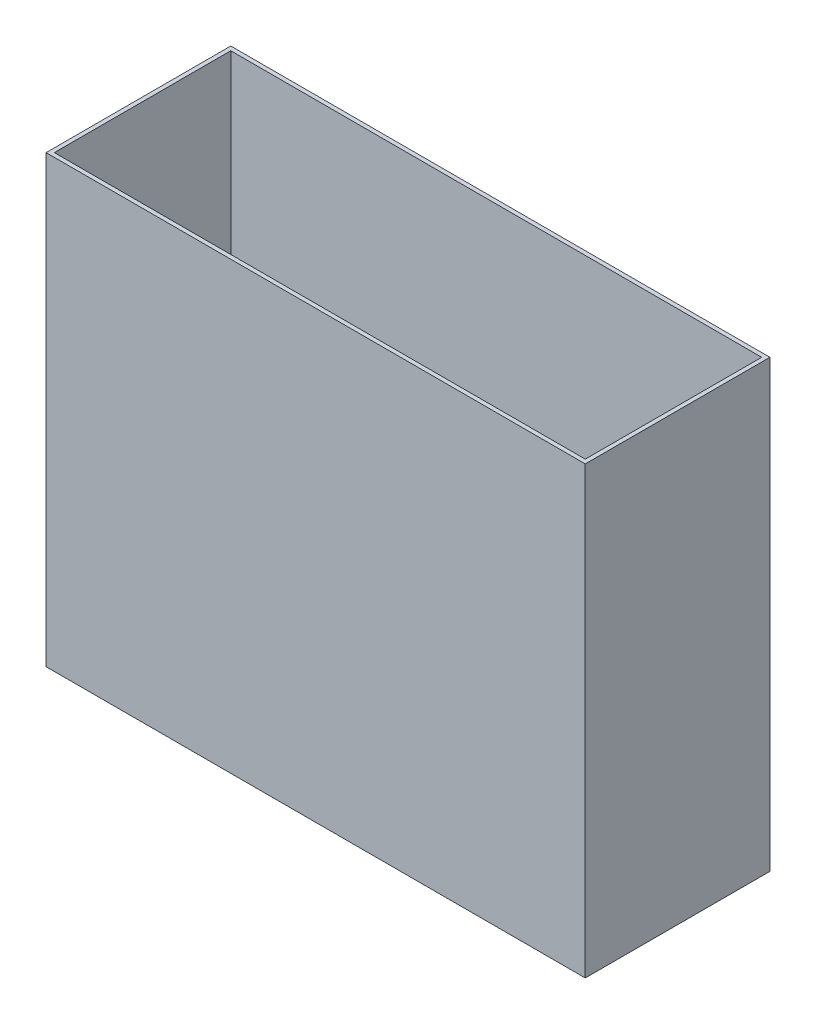
ISO-10303-21;
HEADER;
FILE_DESCRIPTION(('STEP AP214'),'2;1');
FILE_NAME('part.step','',(''),(''),'','','');
FILE_SCHEMA(('AUTOMOTIVE_DESIGN { 1 0 10303 214 1 1 1 1 }'));
ENDSEC;
DATA;
#1=APPLICATION_CONTEXT('core data for automotive mechanical design processes');
#2=APPLICATION_PROTOCOL_DEFINITION('international standard','automotive_design',2000,#1);
#3=PRODUCT_CONTEXT('',#1,'mechanical');
#4=PRODUCT('Part','Part','',(#3));
#5=PRODUCT_RELATED_PRODUCT_CATEGORY('part','',(#4));
#6=PRODUCT_DEFINITION_FORMATION('','',#4);
#7=PRODUCT_DEFINITION_CONTEXT('part definition',#1,'design');
#8=PRODUCT_DEFINITION('design','',#6,#7);
#9=PRODUCT_DEFINITION_SHAPE('','',#8);
#10=(LENGTH_UNIT() NAMED_UNIT(*) SI_UNIT(.MILLI.,.METRE.));
#11=(NAMED_UNIT(*) PLANE_ANGLE_UNIT() SI_UNIT($,.RADIAN.));
#12=(NAMED_UNIT(*) SI_UNIT($,.STERADIAN.) SOLID_ANGLE_UNIT());
#13=UNCERTAINTY_MEASURE_WITH_UNIT(LENGTH_MEASURE(1.E-05),#10,'distance_accuracy_value','');
#14=(GEOMETRIC_REPRESENTATION_CONTEXT(3) GLOBAL_UNCERTAINTY_ASSIGNED_CONTEXT((#13)) GLOBAL_UNIT_ASSIGNED_CONTEXT((#10,
#11,#12)) REPRESENTATION_CONTEXT('',''));
#15=CARTESIAN_POINT('',(0.,0.,0.));
#16=DIRECTION('',(0.,0.,1.));
#17=DIRECTION('',(1.,0.,0.));
#18=AXIS2_PLACEMENT_3D('',#15,#16,#17);
#19=CARTESIAN_POINT('',(-2.59999999999999,280.,-112.));
#20=DIRECTION('',(1.,0.,0.));
#21=DIRECTION('',(0.,0.,-1.));
#22=AXIS2_PLACEMENT_3D('',#19,#20,#21);
#23=PLANE('',#22);
#24=DIRECTION('',(0.,0.,1.));
#25=VECTOR('',#24,1.);
#26=CARTESIAN_POINT('',(-2.59999999999999,-2.59999999999999,-112.));
#27=LINE('',#26,#25);
#28=CARTESIAN_POINT('',(-2.59999999999999,-2.6,-114.6));
#29=VERTEX_POINT('',#28);
#30=CARTESIAN_POINT('',(-2.6,-2.6,2.6));
#31=VERTEX_POINT('',#30);
#32=EDGE_CURVE('E123',#29,#31,#27,.T.);
#33=ORIENTED_EDGE('',*,*,#32,.T.);
#34=DIRECTION('',(0.,-1.,0.));
#35=VECTOR('',#34,1.);
#36=CARTESIAN_POINT('',(-2.6,280.,2.6));
#37=LINE('',#36,#35);
#38=CARTESIAN_POINT('',(-2.6,280.,2.6));
#39=VERTEX_POINT('',#38);
#40=EDGE_CURVE('E11',#39,#31,#37,.T.);
#41=ORIENTED_EDGE('',*,*,#40,.F.);
#42=DIRECTION('',(0.,0.,1.));
#43=VECTOR('',#42,1.);
#44=CARTESIAN_POINT('',(-2.59999999999999,280.,-112.));
#45=LINE('',#44,#43);
#46=CARTESIAN_POINT('',(-2.59999999999999,280.,-114.6));
#47=VERTEX_POINT('',#46);
#48=EDGE_CURVE('E159',#47,#39,#45,.T.);
#49=ORIENTED_EDGE('',*,*,#48,.F.);
#50=DIRECTION('',(0.,-1.,0.));
#51=VECTOR('',#50,1.);
#52=CARTESIAN_POINT('',(-2.59999999999999,280.,-114.6));
#53=LINE('',#52,#51);
#54=EDGE_CURVE('E146',#47,#29,#53,.T.);
#55=ORIENTED_EDGE('',*,*,#54,.T.);
#56=EDGE_LOOP('',(#33,#41,#49,#55));
#57=FACE_BOUND('',#56,.T.);
#58=ADVANCED_FACE('F35',(#57),#23,.F.);
#59=CARTESIAN_POINT('',(0.,280.,2.6));
#60=DIRECTION('',(0.,0.,-1.));
#61=DIRECTION('',(-1.,0.,0.));
#62=AXIS2_PLACEMENT_3D('',#59,#60,#61);
#63=PLANE('',#62);
#64=DIRECTION('',(1.,0.,0.));
#65=VECTOR('',#64,1.);
#66=CARTESIAN_POINT('',(0.,-2.59999999999999,2.6));
#67=LINE('',#66,#65);
#68=CARTESIAN_POINT('',(339.6,-2.6,2.6));
#69=VERTEX_POINT('',#68);
#70=EDGE_CURVE('E144',#31,#69,#67,.T.);
#71=ORIENTED_EDGE('',*,*,#70,.T.);
#72=DIRECTION('',(0.,-1.,0.));
#73=VECTOR('',#72,1.);
#74=CARTESIAN_POINT('',(339.6,280.,2.6));
#75=LINE('',#74,#73);
#76=CARTESIAN_POINT('',(339.6,280.,2.6));
#77=VERTEX_POINT('',#76);
#78=EDGE_CURVE('E44',#77,#69,#75,.T.);
#79=ORIENTED_EDGE('',*,*,#78,.F.);
#80=DIRECTION('',(1.,0.,0.));
#81=VECTOR('',#80,1.);
#82=CARTESIAN_POINT('',(0.,280.,2.6));
#83=LINE('',#82,#81);
#84=EDGE_CURVE('E161',#39,#77,#83,.T.);
#85=ORIENTED_EDGE('',*,*,#84,.F.);
#86=ORIENTED_EDGE('',*,*,#40,.T.);
#87=EDGE_LOOP('',(#71,#79,#85,#86));
#88=FACE_BOUND('',#87,.T.);
#89=ADVANCED_FACE('F177',(#88),#63,.F.);
#90=CARTESIAN_POINT('',(339.6,280.,0.));
#91=DIRECTION('',(-1.,0.,0.));
#92=DIRECTION('',(0.,0.,1.));
#93=AXIS2_PLACEMENT_3D('',#90,#91,#92);
#94=PLANE('',#93);
#95=DIRECTION('',(0.,0.,-1.));
#96=VECTOR('',#95,1.);
#97=CARTESIAN_POINT('',(339.6,-2.59999999999999,0.));
#98=LINE('',#97,#96);
#99=CARTESIAN_POINT('',(339.6,-2.6,-114.6));
#100=VERTEX_POINT('',#99);
#101=EDGE_CURVE('E151',#69,#100,#98,.T.);
#102=ORIENTED_EDGE('',*,*,#101,.T.);
#103=DIRECTION('',(0.,-1.,0.));
#104=VECTOR('',#103,1.);
#105=CARTESIAN_POINT('',(339.6,280.,-114.6));
#106=LINE('',#105,#104);
#107=CARTESIAN_POINT('',(339.6,280.,-114.6));
#108=VERTEX_POINT('',#107);
#109=EDGE_CURVE('E149',#108,#100,#106,.T.);
#110=ORIENTED_EDGE('',*,*,#109,.F.);
#111=DIRECTION('',(0.,0.,-1.));
#112=VECTOR('',#111,1.);
#113=CARTESIAN_POINT('',(339.6,280.,0.));
#114=LINE('',#113,#112);
#115=EDGE_CURVE('E162',#77,#108,#114,.T.);
#116=ORIENTED_EDGE('',*,*,#115,.F.);
#117=ORIENTED_EDGE('',*,*,#78,.T.);
#118=EDGE_LOOP('',(#102,#110,#116,#117));
#119=FACE_BOUND('',#118,.T.);
#120=ADVANCED_FACE('F167',(#119),#94,.F.);
#121=CARTESIAN_POINT('',(337.,280.,-114.6));
#122=DIRECTION('',(0.,0.,1.));
#123=DIRECTION('',(1.,0.,0.));
#124=AXIS2_PLACEMENT_3D('',#121,#122,#123);
#125=PLANE('',#124);
#126=DIRECTION('',(-1.,0.,0.));
#127=VECTOR('',#126,1.);
#128=CARTESIAN_POINT('',(337.,-2.59999999999999,-114.6));
#129=LINE('',#128,#127);
#130=EDGE_CURVE('E155',#100,#29,#129,.T.);
#131=ORIENTED_EDGE('',*,*,#130,.T.);
#132=ORIENTED_EDGE('',*,*,#54,.F.);
#133=DIRECTION('',(-1.,0.,0.));
#134=VECTOR('',#133,1.);
#135=CARTESIAN_POINT('',(337.,280.,-114.6));
#136=LINE('',#135,#134);
#137=EDGE_CURVE('E39',#108,#47,#136,.T.);
#138=ORIENTED_EDGE('',*,*,#137,.F.);
#139=ORIENTED_EDGE('',*,*,#109,.T.);
#140=EDGE_LOOP('',(#131,#132,#138,#139));
#141=FACE_BOUND('',#140,.T.);
#142=ADVANCED_FACE('F171',(#141),#125,.F.);
#143=CARTESIAN_POINT('',(0.,280.,0.));
#144=DIRECTION('',(0.,1.,0.));
#145=DIRECTION('',(0.,0.,1.));
#146=AXIS2_PLACEMENT_3D('',#143,#144,#145);
#147=PLANE('',#146);
#148=DIRECTION('',(0.,0.,1.));
#149=VECTOR('',#148,1.);
#150=CARTESIAN_POINT('',(0.,280.,-112.));
#151=LINE('',#150,#149);
#152=CARTESIAN_POINT('',(0.,280.,-112.));
#153=VERTEX_POINT('',#152);
#154=CARTESIAN_POINT('',(0.,280.,0.));
#155=VERTEX_POINT('',#154);
#156=EDGE_CURVE('E104',#153,#155,#151,.T.);
#157=ORIENTED_EDGE('',*,*,#156,.F.);
#158=DIRECTION('',(-1.,0.,0.));
#159=VECTOR('',#158,1.);
#160=CARTESIAN_POINT('',(337.,280.,-112.));
#161=LINE('',#160,#159);
#162=CARTESIAN_POINT('',(337.,280.,-112.));
#163=VERTEX_POINT('',#162);
#164=EDGE_CURVE('E130',#163,#153,#161,.T.);
#165=ORIENTED_EDGE('',*,*,#164,.F.);
#166=DIRECTION('',(0.,0.,-1.));
#167=VECTOR('',#166,1.);
#168=CARTESIAN_POINT('',(337.,280.,0.));
#169=LINE('',#168,#167);
#170=CARTESIAN_POINT('',(337.,280.,0.));
#171=VERTEX_POINT('',#170);
#172=EDGE_CURVE('E128',#171,#163,#169,.T.);
#173=ORIENTED_EDGE('',*,*,#172,.F.);
#174=DIRECTION('',(1.,0.,0.));
#175=VECTOR('',#174,1.);
#176=CARTESIAN_POINT('',(0.,280.,0.));
#177=LINE('',#176,#175);
#178=EDGE_CURVE('E115',#155,#171,#177,.T.);
#179=ORIENTED_EDGE('',*,*,#178,.F.);
#180=EDGE_LOOP('',(#157,#165,#173,#179));
#181=FACE_BOUND('',#180,.T.);
#182=ORIENTED_EDGE('',*,*,#48,.T.);
#183=ORIENTED_EDGE('',*,*,#84,.T.);
#184=ORIENTED_EDGE('',*,*,#115,.T.);
#185=ORIENTED_EDGE('',*,*,#137,.T.);
#186=EDGE_LOOP('',(#182,#183,#184,#185));
#187=FACE_BOUND('',#186,.T.);
#188=ADVANCED_FACE('F127',(#181,#187),#147,.T.);
#189=CARTESIAN_POINT('',(0.,-2.6,0.));
#190=DIRECTION('',(0.,1.,0.));
#191=DIRECTION('',(0.,0.,1.));
#192=AXIS2_PLACEMENT_3D('',#189,#190,#191);
#193=PLANE('',#192);
#194=ORIENTED_EDGE('',*,*,#32,.F.);
#195=ORIENTED_EDGE('',*,*,#130,.F.);
#196=ORIENTED_EDGE('',*,*,#101,.F.);
#197=ORIENTED_EDGE('',*,*,#70,.F.);
#198=EDGE_LOOP('',(#194,#195,#196,#197));
#199=FACE_BOUND('',#198,.T.);
#200=ADVANCED_FACE('F37',(#199),#193,.F.);
#201=CARTESIAN_POINT('',(0.,280.,-112.));
#202=DIRECTION('',(1.,0.,0.));
#203=DIRECTION('',(0.,0.,-1.));
#204=AXIS2_PLACEMENT_3D('',#201,#202,#203);
#205=PLANE('',#204);
#206=DIRECTION('',(0.,0.,1.));
#207=VECTOR('',#206,1.);
#208=CARTESIAN_POINT('',(0.,0.,-112.));
#209=LINE('',#208,#207);
#210=CARTESIAN_POINT('',(0.,0.,-112.));
#211=VERTEX_POINT('',#210);
#212=CARTESIAN_POINT('',(0.,0.,0.));
#213=VERTEX_POINT('',#212);
#214=EDGE_CURVE('E134',#211,#213,#209,.T.);
#215=ORIENTED_EDGE('',*,*,#214,.F.);
#216=DIRECTION('',(0.,-1.,0.));
#217=VECTOR('',#216,1.);
#218=CARTESIAN_POINT('',(0.,280.,-112.));
#219=LINE('',#218,#217);
#220=EDGE_CURVE('E111',#153,#211,#219,.T.);
#221=ORIENTED_EDGE('',*,*,#220,.F.);
#222=ORIENTED_EDGE('',*,*,#156,.T.);
#223=DIRECTION('',(0.,-1.,0.));
#224=VECTOR('',#223,1.);
#225=CARTESIAN_POINT('',(0.,280.,0.));
#226=LINE('',#225,#224);
#227=EDGE_CURVE('E108',#155,#213,#226,.T.);
#228=ORIENTED_EDGE('',*,*,#227,.T.);
#229=EDGE_LOOP('',(#215,#221,#222,#228));
#230=FACE_BOUND('',#229,.T.);
#231=ADVANCED_FACE('F107',(#230),#205,.T.);
#232=CARTESIAN_POINT('',(0.,280.,0.));
#233=DIRECTION('',(0.,0.,-1.));
#234=DIRECTION('',(-1.,0.,0.));
#235=AXIS2_PLACEMENT_3D('',#232,#233,#234);
#236=PLANE('',#235);
#237=DIRECTION('',(1.,0.,0.));
#238=VECTOR('',#237,1.);
#239=CARTESIAN_POINT('',(0.,0.,0.));
#240=LINE('',#239,#238);
#241=CARTESIAN_POINT('',(337.,0.,0.));
#242=VERTEX_POINT('',#241);
#243=EDGE_CURVE('E122',#213,#242,#240,.T.);
#244=ORIENTED_EDGE('',*,*,#243,.F.);
#245=ORIENTED_EDGE('',*,*,#227,.F.);
#246=ORIENTED_EDGE('',*,*,#178,.T.);
#247=DIRECTION('',(0.,-1.,0.));
#248=VECTOR('',#247,1.);
#249=CARTESIAN_POINT('',(337.,280.,0.));
#250=LINE('',#249,#248);
#251=EDGE_CURVE('E124',#171,#242,#250,.T.);
#252=ORIENTED_EDGE('',*,*,#251,.T.);
#253=EDGE_LOOP('',(#244,#245,#246,#252));
#254=FACE_BOUND('',#253,.T.);
#255=ADVANCED_FACE('F119',(#254),#236,.T.);
#256=CARTESIAN_POINT('',(337.,280.,0.));
#257=DIRECTION('',(-1.,0.,0.));
#258=DIRECTION('',(0.,0.,1.));
#259=AXIS2_PLACEMENT_3D('',#256,#257,#258);
#260=PLANE('',#259);
#261=DIRECTION('',(0.,0.,-1.));
#262=VECTOR('',#261,1.);
#263=CARTESIAN_POINT('',(337.,0.,0.));
#264=LINE('',#263,#262);
#265=CARTESIAN_POINT('',(337.,0.,-112.));
#266=VERTEX_POINT('',#265);
#267=EDGE_CURVE('E137',#242,#266,#264,.T.);
#268=ORIENTED_EDGE('',*,*,#267,.F.);
#269=ORIENTED_EDGE('',*,*,#251,.F.);
#270=ORIENTED_EDGE('',*,*,#172,.T.);
#271=DIRECTION('',(0.,-1.,0.));
#272=VECTOR('',#271,1.);
#273=CARTESIAN_POINT('',(337.,280.,-112.));
#274=LINE('',#273,#272);
#275=EDGE_CURVE('E52',#163,#266,#274,.T.);
#276=ORIENTED_EDGE('',*,*,#275,.T.);
#277=EDGE_LOOP('',(#268,#269,#270,#276));
#278=FACE_BOUND('',#277,.T.);
#279=ADVANCED_FACE('F222',(#278),#260,.T.);
#280=CARTESIAN_POINT('',(337.,280.,-112.));
#281=DIRECTION('',(0.,0.,1.));
#282=DIRECTION('',(1.,0.,0.));
#283=AXIS2_PLACEMENT_3D('',#280,#281,#282);
#284=PLANE('',#283);
#285=DIRECTION('',(-1.,0.,0.));
#286=VECTOR('',#285,1.);
#287=CARTESIAN_POINT('',(337.,0.,-112.));
#288=LINE('',#287,#286);
#289=EDGE_CURVE('E116',#266,#211,#288,.T.);
#290=ORIENTED_EDGE('',*,*,#289,.F.);
#291=ORIENTED_EDGE('',*,*,#275,.F.);
#292=ORIENTED_EDGE('',*,*,#164,.T.);
#293=ORIENTED_EDGE('',*,*,#220,.T.);
#294=EDGE_LOOP('',(#290,#291,#292,#293));
#295=FACE_BOUND('',#294,.T.);
#296=ADVANCED_FACE('F231',(#295),#284,.T.);
#297=CARTESIAN_POINT('',(0.,0.,0.));
#298=DIRECTION('',(0.,1.,0.));
#299=DIRECTION('',(0.,0.,1.));
#300=AXIS2_PLACEMENT_3D('',#297,#298,#299);
#301=PLANE('',#300);
#302=ORIENTED_EDGE('',*,*,#214,.T.);
#303=ORIENTED_EDGE('',*,*,#243,.T.);
#304=ORIENTED_EDGE('',*,*,#267,.T.);
#305=ORIENTED_EDGE('',*,*,#289,.T.);
#306=EDGE_LOOP('',(#302,#303,#304,#305));
#307=FACE_BOUND('',#306,.T.);
#308=ADVANCED_FACE('F241',(#307),#301,.T.);
#309=CLOSED_SHELL('',(#58,#89,#120,#142,#188,#200,#231,#255,#279,#296,#308));
#310=MANIFOLD_SOLID_BREP('B2',#309);
#311=ADVANCED_BREP_SHAPE_REPRESENTATION('',(#18,#310),#14);
#312=SHAPE_DEFINITION_REPRESENTATION(#9,#311);
ENDSEC;
END-ISO-10303-21;
